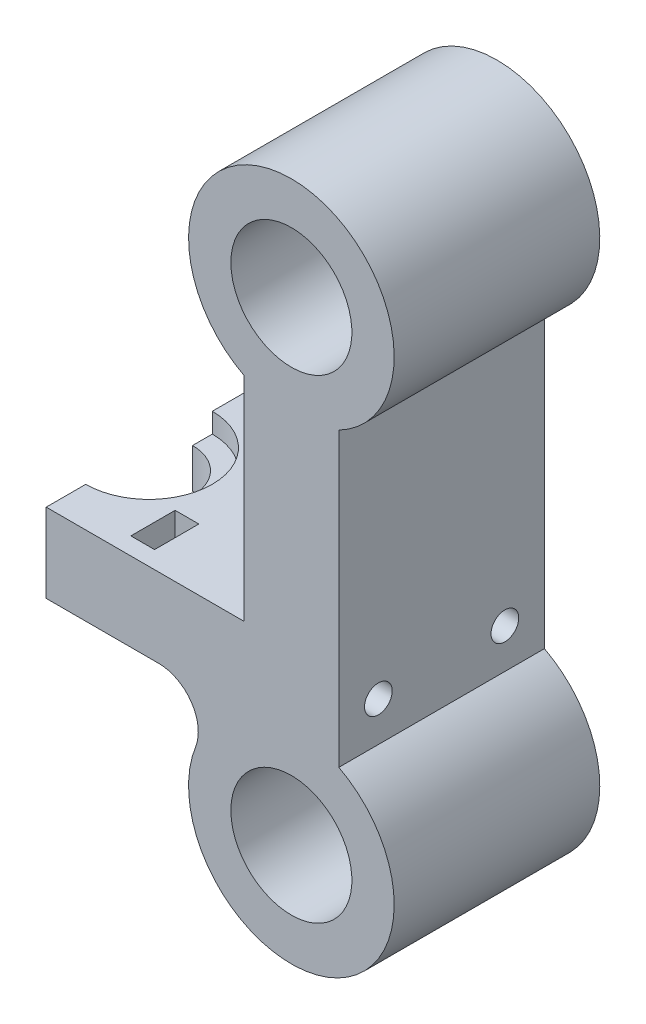
ISO-10303-21;
HEADER;
FILE_DESCRIPTION(('STEP AP214'),'2;1');
FILE_NAME('part.step','',(''),(''),'','','');
FILE_SCHEMA(('AUTOMOTIVE_DESIGN { 1 0 10303 214 1 1 1 1 }'));
ENDSEC;
DATA;
#1=APPLICATION_CONTEXT('core data for automotive mechanical design processes');
#2=APPLICATION_PROTOCOL_DEFINITION('international standard','automotive_design',2000,#1);
#3=PRODUCT_CONTEXT('',#1,'mechanical');
#4=PRODUCT('Part','Part','',(#3));
#5=PRODUCT_RELATED_PRODUCT_CATEGORY('part','',(#4));
#6=PRODUCT_DEFINITION_FORMATION('','',#4);
#7=PRODUCT_DEFINITION_CONTEXT('part definition',#1,'design');
#8=PRODUCT_DEFINITION('design','',#6,#7);
#9=PRODUCT_DEFINITION_SHAPE('','',#8);
#10=(LENGTH_UNIT() NAMED_UNIT(*) SI_UNIT(.MILLI.,.METRE.));
#11=(NAMED_UNIT(*) PLANE_ANGLE_UNIT() SI_UNIT($,.RADIAN.));
#12=(NAMED_UNIT(*) SI_UNIT($,.STERADIAN.) SOLID_ANGLE_UNIT());
#13=UNCERTAINTY_MEASURE_WITH_UNIT(LENGTH_MEASURE(1.E-05),#10,'distance_accuracy_value','');
#14=(GEOMETRIC_REPRESENTATION_CONTEXT(3) GLOBAL_UNCERTAINTY_ASSIGNED_CONTEXT((#13)) GLOBAL_UNIT_ASSIGNED_CONTEXT((#10,
#11,#12)) REPRESENTATION_CONTEXT('',''));
#15=CARTESIAN_POINT('',(0.,0.,0.));
#16=DIRECTION('',(0.,0.,1.));
#17=DIRECTION('',(1.,0.,0.));
#18=AXIS2_PLACEMENT_3D('',#15,#16,#17);
#19=CARTESIAN_POINT('',(13.,-13.4674374053292,21.));
#20=DIRECTION('',(-1.,0.,0.));
#21=DIRECTION('',(0.,0.,1.));
#22=AXIS2_PLACEMENT_3D('',#19,#20,#21);
#23=CYLINDRICAL_SURFACE('',#22,1.75);
#24=CARTESIAN_POINT('',(-22.5,-13.4674374053292,21.));
#25=DIRECTION('',(-1.,0.,0.));
#26=DIRECTION('',(0.,-1.,0.));
#27=AXIS2_PLACEMENT_3D('',#24,#25,#26);
#28=CIRCLE('',#27,1.75);
#29=CARTESIAN_POINT('',(-22.5,-15.2174374053292,21.));
#30=VERTEX_POINT('',#29);
#31=EDGE_CURVE('E212',#30,#30,#28,.F.);
#32=ORIENTED_EDGE('',*,*,#31,.T.);
#33=EDGE_LOOP('',(#32));
#34=FACE_BOUND('',#33,.T.);
#35=CARTESIAN_POINT('',(-31.,-13.4674374053292,21.));
#36=DIRECTION('',(-1.,0.,0.));
#37=DIRECTION('',(0.,0.,-1.));
#38=AXIS2_PLACEMENT_3D('',#35,#36,#37);
#39=CIRCLE('',#38,1.75);
#40=CARTESIAN_POINT('',(-31.,-13.4674374053292,19.25));
#41=VERTEX_POINT('',#40);
#42=EDGE_CURVE('E244',#41,#41,#39,.T.);
#43=ORIENTED_EDGE('',*,*,#42,.T.);
#44=EDGE_LOOP('',(#43));
#45=FACE_BOUND('',#44,.T.);
#46=ADVANCED_FACE('F33',(#34,#45),#23,.F.);
#47=CARTESIAN_POINT('',(13.,-13.4674374053292,5.));
#48=DIRECTION('',(-1.,0.,0.));
#49=DIRECTION('',(0.,0.,1.));
#50=AXIS2_PLACEMENT_3D('',#47,#48,#49);
#51=CYLINDRICAL_SURFACE('',#50,1.75);
#52=CARTESIAN_POINT('',(-19.5,-13.4674374053292,5.));
#53=DIRECTION('',(1.,0.,0.));
#54=DIRECTION('',(0.,1.,0.));
#55=AXIS2_PLACEMENT_3D('',#52,#53,#54);
#56=CIRCLE('',#55,1.75);
#57=CARTESIAN_POINT('',(-19.5,-11.7174374053292,5.));
#58=VERTEX_POINT('',#57);
#59=EDGE_CURVE('E240',#58,#58,#56,.F.);
#60=ORIENTED_EDGE('',*,*,#59,.T.);
#61=EDGE_LOOP('',(#60));
#62=FACE_BOUND('',#61,.T.);
#63=CARTESIAN_POINT('',(6.00000000000001,-13.4674374053292,5.));
#64=DIRECTION('',(-1.,0.,0.));
#65=DIRECTION('',(0.,-1.,0.));
#66=AXIS2_PLACEMENT_3D('',#63,#64,#65);
#67=CIRCLE('',#66,1.75);
#68=CARTESIAN_POINT('',(6.00000000000001,-15.2174374053292,5.));
#69=VERTEX_POINT('',#68);
#70=EDGE_CURVE('E251',#69,#69,#67,.T.);
#71=ORIENTED_EDGE('',*,*,#70,.F.);
#72=EDGE_LOOP('',(#71));
#73=FACE_BOUND('',#72,.T.);
#74=ADVANCED_FACE('F398',(#62,#73),#51,.F.);
#75=CARTESIAN_POINT('',(-31.,-18.4674374053292,26.));
#76=DIRECTION('',(1.,0.,0.));
#77=DIRECTION('',(0.,0.,-1.));
#78=AXIS2_PLACEMENT_3D('',#75,#76,#77);
#79=PLANE('',#78);
#80=CARTESIAN_POINT('',(-31.,-13.4674374053292,5.));
#81=DIRECTION('',(-1.,0.,0.));
#82=DIRECTION('',(0.,0.,1.));
#83=AXIS2_PLACEMENT_3D('',#80,#81,#82);
#84=CIRCLE('',#83,1.75);
#85=CARTESIAN_POINT('',(-31.,-13.4674374053292,6.75));
#86=VERTEX_POINT('',#85);
#87=EDGE_CURVE('E248',#86,#86,#84,.T.);
#88=ORIENTED_EDGE('',*,*,#87,.F.);
#89=EDGE_LOOP('',(#88));
#90=FACE_BOUND('',#89,.T.);
#91=DIRECTION('',(0.,1.,0.));
#92=VECTOR('',#91,1.);
#93=CARTESIAN_POINT('',(-31.,-8.4674374053292,5.));
#94=LINE('',#93,#92);
#95=CARTESIAN_POINT('',(-31.,-8.4674374053292,5.));
#96=VERTEX_POINT('',#95);
#97=CARTESIAN_POINT('',(-31.,-10.9674374053292,5.));
#98=VERTEX_POINT('',#97);
#99=EDGE_CURVE('E359',#96,#98,#94,.F.);
#100=ORIENTED_EDGE('',*,*,#99,.F.);
#101=DIRECTION('',(0.,0.,-1.));
#102=VECTOR('',#101,1.);
#103=CARTESIAN_POINT('',(-31.,-8.46743740532921,26.));
#104=LINE('',#103,#102);
#105=CARTESIAN_POINT('',(-31.,-8.46743740532921,0.));
#106=VERTEX_POINT('',#105);
#107=EDGE_CURVE('E337',#96,#106,#104,.T.);
#108=ORIENTED_EDGE('',*,*,#107,.T.);
#109=DIRECTION('',(0.,-1.,0.));
#110=VECTOR('',#109,1.);
#111=CARTESIAN_POINT('',(-31.,-18.4674374053292,0.));
#112=LINE('',#111,#110);
#113=CARTESIAN_POINT('',(-31.,-18.4674374053292,0.));
#114=VERTEX_POINT('',#113);
#115=EDGE_CURVE('E312',#106,#114,#112,.T.);
#116=ORIENTED_EDGE('',*,*,#115,.T.);
#117=DIRECTION('',(0.,0.,-1.));
#118=VECTOR('',#117,1.);
#119=CARTESIAN_POINT('',(-31.,-18.4674374053292,26.));
#120=LINE('',#119,#118);
#121=CARTESIAN_POINT('',(-31.,-18.4674374053292,5.));
#122=VERTEX_POINT('',#121);
#123=EDGE_CURVE('E333',#122,#114,#120,.T.);
#124=ORIENTED_EDGE('',*,*,#123,.F.);
#125=DIRECTION('',(0.,1.,0.));
#126=VECTOR('',#125,1.);
#127=CARTESIAN_POINT('',(-31.,-8.4674374053292,5.));
#128=LINE('',#127,#126);
#129=CARTESIAN_POINT('',(-31.,-15.9674374053292,5.));
#130=VERTEX_POINT('',#129);
#131=EDGE_CURVE('E271',#130,#122,#128,.F.);
#132=ORIENTED_EDGE('',*,*,#131,.F.);
#133=DIRECTION('',(0.,0.,-1.));
#134=VECTOR('',#133,1.);
#135=CARTESIAN_POINT('',(-31.,-15.9674374053292,26.));
#136=LINE('',#135,#134);
#137=CARTESIAN_POINT('',(-31.,-15.9674374053292,7.5));
#138=VERTEX_POINT('',#137);
#139=EDGE_CURVE('E350',#138,#130,#136,.T.);
#140=ORIENTED_EDGE('',*,*,#139,.F.);
#141=DIRECTION('',(0.,1.,0.));
#142=VECTOR('',#141,1.);
#143=CARTESIAN_POINT('',(-31.,-8.4674374053292,7.5));
#144=LINE('',#143,#142);
#145=CARTESIAN_POINT('',(-31.,-10.9674374053292,7.5));
#146=VERTEX_POINT('',#145);
#147=EDGE_CURVE('E357',#146,#138,#144,.F.);
#148=ORIENTED_EDGE('',*,*,#147,.F.);
#149=DIRECTION('',(0.,0.,1.));
#150=VECTOR('',#149,1.);
#151=CARTESIAN_POINT('',(-31.,-10.9674374053292,26.));
#152=LINE('',#151,#150);
#153=EDGE_CURVE('E355',#98,#146,#152,.T.);
#154=ORIENTED_EDGE('',*,*,#153,.F.);
#155=EDGE_LOOP('',(#100,#108,#116,#124,#132,#140,#148,#154));
#156=FACE_BOUND('',#155,.T.);
#157=ADVANCED_FACE('F405',(#90,#156),#79,.F.);
#158=ORIENTED_EDGE('',*,*,#42,.F.);
#159=EDGE_LOOP('',(#158));
#160=FACE_BOUND('',#159,.T.);
#161=DIRECTION('',(0.,1.,0.));
#162=VECTOR('',#161,1.);
#163=CARTESIAN_POINT('',(-31.,-8.46743740532919,21.));
#164=LINE('',#163,#162);
#165=CARTESIAN_POINT('',(-31.,-10.9674374053292,21.));
#166=VERTEX_POINT('',#165);
#167=CARTESIAN_POINT('',(-31.,-8.4674374053292,21.));
#168=VERTEX_POINT('',#167);
#169=EDGE_CURVE('E354',#166,#168,#164,.T.);
#170=ORIENTED_EDGE('',*,*,#169,.F.);
#171=CARTESIAN_POINT('',(-31.,-10.9674374053292,18.5));
#172=VERTEX_POINT('',#171);
#173=EDGE_CURVE('E352',#172,#166,#152,.T.);
#174=ORIENTED_EDGE('',*,*,#173,.F.);
#175=DIRECTION('',(0.,1.,0.));
#176=VECTOR('',#175,1.);
#177=CARTESIAN_POINT('',(-31.,-8.4674374053292,18.5));
#178=LINE('',#177,#176);
#179=CARTESIAN_POINT('',(-31.,-15.9674374053292,18.5));
#180=VERTEX_POINT('',#179);
#181=EDGE_CURVE('E349',#180,#172,#178,.T.);
#182=ORIENTED_EDGE('',*,*,#181,.F.);
#183=CARTESIAN_POINT('',(-31.,-15.9674374053292,21.));
#184=VERTEX_POINT('',#183);
#185=EDGE_CURVE('E347',#184,#180,#136,.T.);
#186=ORIENTED_EDGE('',*,*,#185,.F.);
#187=DIRECTION('',(0.,1.,0.));
#188=VECTOR('',#187,1.);
#189=CARTESIAN_POINT('',(-31.,-8.46743740532919,21.));
#190=LINE('',#189,#188);
#191=CARTESIAN_POINT('',(-31.,-18.4674374053292,21.));
#192=VERTEX_POINT('',#191);
#193=EDGE_CURVE('E269',#192,#184,#190,.T.);
#194=ORIENTED_EDGE('',*,*,#193,.F.);
#195=CARTESIAN_POINT('',(-31.,-18.4674374053292,26.));
#196=VERTEX_POINT('',#195);
#197=EDGE_CURVE('E334',#196,#192,#120,.T.);
#198=ORIENTED_EDGE('',*,*,#197,.F.);
#199=DIRECTION('',(0.,-1.,0.));
#200=VECTOR('',#199,1.);
#201=CARTESIAN_POINT('',(-31.,-18.4674374053292,26.));
#202=LINE('',#201,#200);
#203=CARTESIAN_POINT('',(-31.,-8.46743740532921,26.));
#204=VERTEX_POINT('',#203);
#205=EDGE_CURVE('E294',#204,#196,#202,.T.);
#206=ORIENTED_EDGE('',*,*,#205,.F.);
#207=EDGE_CURVE('E338',#204,#168,#104,.T.);
#208=ORIENTED_EDGE('',*,*,#207,.T.);
#209=EDGE_LOOP('',(#170,#174,#182,#186,#194,#198,#206,#208));
#210=FACE_BOUND('',#209,.T.);
#211=ADVANCED_FACE('F481',(#160,#210),#79,.F.);
#212=CARTESIAN_POINT('',(0.,30.,26.));
#213=DIRECTION('',(0.,0.,1.));
#214=DIRECTION('',(1.,0.,0.));
#215=AXIS2_PLACEMENT_3D('',#212,#213,#214);
#216=PLANE('',#215);
#217=CARTESIAN_POINT('',(0.,30.,26.));
#218=DIRECTION('',(0.,0.,1.));
#219=DIRECTION('',(1.,0.,0.));
#220=AXIS2_PLACEMENT_3D('',#217,#218,#219);
#221=CIRCLE('',#220,7.65);
#222=CARTESIAN_POINT('',(-7.65000000000001,30.,26.));
#223=VERTEX_POINT('',#222);
#224=EDGE_CURVE('E280',#223,#223,#221,.T.);
#225=ORIENTED_EDGE('',*,*,#224,.F.);
#226=EDGE_LOOP('',(#225));
#227=FACE_BOUND('',#226,.T.);
#228=CARTESIAN_POINT('',(0.,30.,26.));
#229=DIRECTION('',(0.,0.,1.));
#230=DIRECTION('',(1.,0.,0.));
#231=AXIS2_PLACEMENT_3D('',#228,#229,#230);
#232=CIRCLE('',#231,13.);
#233=CARTESIAN_POINT('',(6.,18.4674374053292,26.));
#234=VERTEX_POINT('',#233);
#235=CARTESIAN_POINT('',(-6.,18.4674374053292,26.));
#236=VERTEX_POINT('',#235);
#237=EDGE_CURVE('E286',#234,#236,#232,.T.);
#238=ORIENTED_EDGE('',*,*,#237,.T.);
#239=DIRECTION('',(0.,-1.,0.));
#240=VECTOR('',#239,1.);
#241=CARTESIAN_POINT('',(-6.,18.4674374053292,26.));
#242=LINE('',#241,#240);
#243=CARTESIAN_POINT('',(-5.99999999999999,-8.46743740532921,26.));
#244=VERTEX_POINT('',#243);
#245=EDGE_CURVE('E289',#236,#244,#242,.T.);
#246=ORIENTED_EDGE('',*,*,#245,.T.);
#247=DIRECTION('',(-1.,0.,0.));
#248=VECTOR('',#247,1.);
#249=CARTESIAN_POINT('',(-31.,-8.46743740532921,26.));
#250=LINE('',#249,#248);
#251=EDGE_CURVE('E292',#244,#204,#250,.T.);
#252=ORIENTED_EDGE('',*,*,#251,.T.);
#253=ORIENTED_EDGE('',*,*,#205,.T.);
#254=DIRECTION('',(1.,0.,0.));
#255=VECTOR('',#254,1.);
#256=CARTESIAN_POINT('',(-16.7727644098016,-18.4674374053292,26.));
#257=LINE('',#256,#255);
#258=CARTESIAN_POINT('',(-16.7727644098016,-18.4674374053292,26.));
#259=VERTEX_POINT('',#258);
#260=EDGE_CURVE('E296',#196,#259,#257,.T.);
#261=ORIENTED_EDGE('',*,*,#260,.T.);
#262=CARTESIAN_POINT('',(-16.7727644098016,-23.4674374053292,26.));
#263=DIRECTION('',(0.,0.,-1.));
#264=DIRECTION('',(-1.,0.,0.));
#265=AXIS2_PLACEMENT_3D('',#262,#263,#264);
#266=CIRCLE('',#265,5.);
#267=CARTESIAN_POINT('',(-12.1136631848567,-25.2820381260711,26.));
#268=VERTEX_POINT('',#267);
#269=EDGE_CURVE('E298',#259,#268,#266,.T.);
#270=ORIENTED_EDGE('',*,*,#269,.T.);
#271=CARTESIAN_POINT('',(0.,-30.,26.));
#272=DIRECTION('',(0.,0.,1.));
#273=DIRECTION('',(1.,0.,0.));
#274=AXIS2_PLACEMENT_3D('',#271,#272,#273);
#275=CIRCLE('',#274,13.);
#276=CARTESIAN_POINT('',(6.00000000000001,-18.4674374053292,26.));
#277=VERTEX_POINT('',#276);
#278=EDGE_CURVE('E300',#268,#277,#275,.T.);
#279=ORIENTED_EDGE('',*,*,#278,.T.);
#280=DIRECTION('',(0.,1.,0.));
#281=VECTOR('',#280,1.);
#282=CARTESIAN_POINT('',(6.,18.4674374053292,26.));
#283=LINE('',#282,#281);
#284=EDGE_CURVE('E302',#277,#234,#283,.T.);
#285=ORIENTED_EDGE('',*,*,#284,.T.);
#286=EDGE_LOOP('',(#238,#246,#252,#253,#261,#270,#279,#285));
#287=FACE_BOUND('',#286,.T.);
#288=CARTESIAN_POINT('',(0.,-30.,26.));
#289=DIRECTION('',(0.,0.,1.));
#290=DIRECTION('',(1.,0.,0.));
#291=AXIS2_PLACEMENT_3D('',#288,#289,#290);
#292=CIRCLE('',#291,7.65);
#293=CARTESIAN_POINT('',(-7.64999999999999,-30.,26.));
#294=VERTEX_POINT('',#293);
#295=EDGE_CURVE('E274',#294,#294,#292,.T.);
#296=ORIENTED_EDGE('',*,*,#295,.F.);
#297=EDGE_LOOP('',(#296));
#298=FACE_BOUND('',#297,.T.);
#299=ADVANCED_FACE('F454',(#227,#287,#298),#216,.T.);
#300=CARTESIAN_POINT('',(0.,30.,0.));
#301=DIRECTION('',(0.,0.,1.));
#302=DIRECTION('',(1.,0.,0.));
#303=AXIS2_PLACEMENT_3D('',#300,#301,#302);
#304=PLANE('',#303);
#305=CARTESIAN_POINT('',(0.,30.,0.));
#306=DIRECTION('',(0.,0.,1.));
#307=DIRECTION('',(1.,0.,0.));
#308=AXIS2_PLACEMENT_3D('',#305,#306,#307);
#309=CIRCLE('',#308,13.);
#310=CARTESIAN_POINT('',(6.,18.4674374053292,0.));
#311=VERTEX_POINT('',#310);
#312=CARTESIAN_POINT('',(-6.,18.4674374053292,0.));
#313=VERTEX_POINT('',#312);
#314=EDGE_CURVE('E283',#311,#313,#309,.T.);
#315=ORIENTED_EDGE('',*,*,#314,.F.);
#316=DIRECTION('',(0.,1.,0.));
#317=VECTOR('',#316,1.);
#318=CARTESIAN_POINT('',(6.,18.4674374053292,0.));
#319=LINE('',#318,#317);
#320=CARTESIAN_POINT('',(6.00000000000001,-18.4674374053292,0.));
#321=VERTEX_POINT('',#320);
#322=EDGE_CURVE('E290',#321,#311,#319,.T.);
#323=ORIENTED_EDGE('',*,*,#322,.F.);
#324=CARTESIAN_POINT('',(0.,-30.,0.));
#325=DIRECTION('',(0.,0.,1.));
#326=DIRECTION('',(1.,0.,0.));
#327=AXIS2_PLACEMENT_3D('',#324,#325,#326);
#328=CIRCLE('',#327,13.);
#329=CARTESIAN_POINT('',(-12.1136631848567,-25.2820381260711,0.));
#330=VERTEX_POINT('',#329);
#331=EDGE_CURVE('E319',#330,#321,#328,.T.);
#332=ORIENTED_EDGE('',*,*,#331,.F.);
#333=CARTESIAN_POINT('',(-16.7727644098016,-23.4674374053292,0.));
#334=DIRECTION('',(0.,0.,-1.));
#335=DIRECTION('',(-1.,0.,0.));
#336=AXIS2_PLACEMENT_3D('',#333,#334,#335);
#337=CIRCLE('',#336,5.);
#338=CARTESIAN_POINT('',(-16.7727644098016,-18.4674374053292,0.));
#339=VERTEX_POINT('',#338);
#340=EDGE_CURVE('E317',#339,#330,#337,.T.);
#341=ORIENTED_EDGE('',*,*,#340,.F.);
#342=DIRECTION('',(1.,0.,0.));
#343=VECTOR('',#342,1.);
#344=CARTESIAN_POINT('',(-16.7727644098016,-18.4674374053292,0.));
#345=LINE('',#344,#343);
#346=EDGE_CURVE('E315',#114,#339,#345,.T.);
#347=ORIENTED_EDGE('',*,*,#346,.F.);
#348=ORIENTED_EDGE('',*,*,#115,.F.);
#349=DIRECTION('',(-1.,0.,0.));
#350=VECTOR('',#349,1.);
#351=CARTESIAN_POINT('',(-31.,-8.46743740532921,0.));
#352=LINE('',#351,#350);
#353=CARTESIAN_POINT('',(-5.99999999999999,-8.46743740532921,0.));
#354=VERTEX_POINT('',#353);
#355=EDGE_CURVE('E309',#354,#106,#352,.T.);
#356=ORIENTED_EDGE('',*,*,#355,.F.);
#357=DIRECTION('',(0.,-1.,0.));
#358=VECTOR('',#357,1.);
#359=CARTESIAN_POINT('',(-6.,18.4674374053292,0.));
#360=LINE('',#359,#358);
#361=EDGE_CURVE('E307',#313,#354,#360,.T.);
#362=ORIENTED_EDGE('',*,*,#361,.F.);
#363=EDGE_LOOP('',(#315,#323,#332,#341,#347,#348,#356,#362));
#364=FACE_BOUND('',#363,.T.);
#365=CARTESIAN_POINT('',(0.,30.,0.));
#366=DIRECTION('',(0.,0.,1.));
#367=DIRECTION('',(1.,0.,0.));
#368=AXIS2_PLACEMENT_3D('',#365,#366,#367);
#369=CIRCLE('',#368,7.65);
#370=CARTESIAN_POINT('',(-7.65000000000001,30.,0.));
#371=VERTEX_POINT('',#370);
#372=EDGE_CURVE('E277',#371,#371,#369,.T.);
#373=ORIENTED_EDGE('',*,*,#372,.T.);
#374=EDGE_LOOP('',(#373));
#375=FACE_BOUND('',#374,.T.);
#376=CARTESIAN_POINT('',(0.,-30.,0.));
#377=DIRECTION('',(0.,0.,1.));
#378=DIRECTION('',(1.,0.,0.));
#379=AXIS2_PLACEMENT_3D('',#376,#377,#378);
#380=CIRCLE('',#379,7.65);
#381=CARTESIAN_POINT('',(-7.64999999999999,-30.,0.));
#382=VERTEX_POINT('',#381);
#383=EDGE_CURVE('E273',#382,#382,#380,.T.);
#384=ORIENTED_EDGE('',*,*,#383,.T.);
#385=EDGE_LOOP('',(#384));
#386=FACE_BOUND('',#385,.T.);
#387=ADVANCED_FACE('F445',(#364,#375,#386),#304,.F.);
#388=CARTESIAN_POINT('',(0.,30.,26.));
#389=DIRECTION('',(0.,0.,-1.));
#390=DIRECTION('',(-1.,0.,0.));
#391=AXIS2_PLACEMENT_3D('',#388,#389,#390);
#392=CYLINDRICAL_SURFACE('',#391,13.);
#393=ORIENTED_EDGE('',*,*,#314,.T.);
#394=DIRECTION('',(0.,0.,-1.));
#395=VECTOR('',#394,1.);
#396=CARTESIAN_POINT('',(-6.,18.4674374053292,26.));
#397=LINE('',#396,#395);
#398=EDGE_CURVE('E344',#236,#313,#397,.T.);
#399=ORIENTED_EDGE('',*,*,#398,.F.);
#400=ORIENTED_EDGE('',*,*,#237,.F.);
#401=DIRECTION('',(0.,0.,-1.));
#402=VECTOR('',#401,1.);
#403=CARTESIAN_POINT('',(6.,18.4674374053292,26.));
#404=LINE('',#403,#402);
#405=EDGE_CURVE('E304',#234,#311,#404,.T.);
#406=ORIENTED_EDGE('',*,*,#405,.T.);
#407=EDGE_LOOP('',(#393,#399,#400,#406));
#408=FACE_BOUND('',#407,.T.);
#409=ADVANCED_FACE('F35',(#408),#392,.T.);
#410=CARTESIAN_POINT('',(-6.,18.4674374053292,26.));
#411=DIRECTION('',(1.,0.,0.));
#412=DIRECTION('',(0.,1.,0.));
#413=AXIS2_PLACEMENT_3D('',#410,#411,#412);
#414=PLANE('',#413);
#415=ORIENTED_EDGE('',*,*,#361,.T.);
#416=DIRECTION('',(0.,0.,-1.));
#417=VECTOR('',#416,1.);
#418=CARTESIAN_POINT('',(-5.99999999999999,-8.46743740532921,26.));
#419=LINE('',#418,#417);
#420=EDGE_CURVE('E341',#244,#354,#419,.T.);
#421=ORIENTED_EDGE('',*,*,#420,.F.);
#422=ORIENTED_EDGE('',*,*,#245,.F.);
#423=ORIENTED_EDGE('',*,*,#398,.T.);
#424=EDGE_LOOP('',(#415,#421,#422,#423));
#425=FACE_BOUND('',#424,.T.);
#426=ADVANCED_FACE('F451',(#425),#414,.F.);
#427=CARTESIAN_POINT('',(-31.,-8.46743740532921,26.));
#428=DIRECTION('',(0.,-1.,0.));
#429=DIRECTION('',(1.,0.,0.));
#430=AXIS2_PLACEMENT_3D('',#427,#428,#429);
#431=PLANE('',#430);
#432=DIRECTION('',(1.,0.,0.));
#433=VECTOR('',#432,1.);
#434=CARTESIAN_POINT('',(-22.5,-8.46743740532921,23.8));
#435=LINE('',#434,#433);
#436=CARTESIAN_POINT('',(-22.5,-8.46743740532921,23.8));
#437=VERTEX_POINT('',#436);
#438=CARTESIAN_POINT('',(-19.5,-8.46743740532921,23.8));
#439=VERTEX_POINT('',#438);
#440=EDGE_CURVE('E194',#437,#439,#435,.T.);
#441=ORIENTED_EDGE('',*,*,#440,.F.);
#442=DIRECTION('',(0.,0.,1.));
#443=VECTOR('',#442,1.);
#444=CARTESIAN_POINT('',(-22.5,-8.46743740532921,23.8));
#445=LINE('',#444,#443);
#446=CARTESIAN_POINT('',(-22.5,-8.46743740532921,18.2));
#447=VERTEX_POINT('',#446);
#448=EDGE_CURVE('E48',#447,#437,#445,.T.);
#449=ORIENTED_EDGE('',*,*,#448,.F.);
#450=DIRECTION('',(-1.,0.,0.));
#451=VECTOR('',#450,1.);
#452=CARTESIAN_POINT('',(-22.5,-8.46743740532921,18.2));
#453=LINE('',#452,#451);
#454=CARTESIAN_POINT('',(-19.5,-8.46743740532921,18.2));
#455=VERTEX_POINT('',#454);
#456=EDGE_CURVE('E201',#455,#447,#453,.T.);
#457=ORIENTED_EDGE('',*,*,#456,.F.);
#458=DIRECTION('',(0.,0.,-1.));
#459=VECTOR('',#458,1.);
#460=CARTESIAN_POINT('',(-19.5,-8.46743740532921,23.8));
#461=LINE('',#460,#459);
#462=EDGE_CURVE('E185',#439,#455,#461,.T.);
#463=ORIENTED_EDGE('',*,*,#462,.F.);
#464=EDGE_LOOP('',(#441,#449,#457,#463));
#465=FACE_BOUND('',#464,.T.);
#466=DIRECTION('',(-1.,0.,0.));
#467=VECTOR('',#466,1.);
#468=CARTESIAN_POINT('',(-22.5,-8.46743740532921,2.2));
#469=LINE('',#468,#467);
#470=CARTESIAN_POINT('',(-19.5,-8.46743740532921,2.2));
#471=VERTEX_POINT('',#470);
#472=CARTESIAN_POINT('',(-22.5,-8.46743740532921,2.2));
#473=VERTEX_POINT('',#472);
#474=EDGE_CURVE('E218',#471,#473,#469,.T.);
#475=ORIENTED_EDGE('',*,*,#474,.F.);
#476=DIRECTION('',(0.,0.,-1.));
#477=VECTOR('',#476,1.);
#478=CARTESIAN_POINT('',(-19.5,-8.46743740532921,2.2));
#479=LINE('',#478,#477);
#480=CARTESIAN_POINT('',(-19.5,-8.46743740532921,7.8));
#481=VERTEX_POINT('',#480);
#482=EDGE_CURVE('E216',#481,#471,#479,.T.);
#483=ORIENTED_EDGE('',*,*,#482,.F.);
#484=DIRECTION('',(1.,0.,0.));
#485=VECTOR('',#484,1.);
#486=CARTESIAN_POINT('',(-22.5,-8.46743740532921,7.8));
#487=LINE('',#486,#485);
#488=CARTESIAN_POINT('',(-22.5,-8.46743740532921,7.8));
#489=VERTEX_POINT('',#488);
#490=EDGE_CURVE('E224',#489,#481,#487,.T.);
#491=ORIENTED_EDGE('',*,*,#490,.F.);
#492=DIRECTION('',(0.,0.,1.));
#493=VECTOR('',#492,1.);
#494=CARTESIAN_POINT('',(-22.5,-8.46743740532921,2.2));
#495=LINE('',#494,#493);
#496=EDGE_CURVE('E221',#473,#489,#495,.T.);
#497=ORIENTED_EDGE('',*,*,#496,.F.);
#498=EDGE_LOOP('',(#475,#483,#491,#497));
#499=FACE_BOUND('',#498,.T.);
#500=CARTESIAN_POINT('',(-31.,-8.4674374053292,13.));
#501=DIRECTION('',(0.,1.,0.));
#502=DIRECTION('',(0.,0.,1.));
#503=AXIS2_PLACEMENT_3D('',#500,#501,#502);
#504=CIRCLE('',#503,8.);
#505=EDGE_CURVE('E267',#168,#96,#504,.T.);
#506=ORIENTED_EDGE('',*,*,#505,.F.);
#507=ORIENTED_EDGE('',*,*,#207,.F.);
#508=ORIENTED_EDGE('',*,*,#251,.F.);
#509=ORIENTED_EDGE('',*,*,#420,.T.);
#510=ORIENTED_EDGE('',*,*,#355,.T.);
#511=ORIENTED_EDGE('',*,*,#107,.F.);
#512=EDGE_LOOP('',(#506,#507,#508,#509,#510,#511));
#513=FACE_BOUND('',#512,.T.);
#514=ADVANCED_FACE('F198',(#465,#499,#513),#431,.F.);
#515=CARTESIAN_POINT('',(-16.7727644098016,-18.4674374053292,26.));
#516=DIRECTION('',(0.,1.,0.));
#517=DIRECTION('',(-1.,0.,0.));
#518=AXIS2_PLACEMENT_3D('',#515,#516,#517);
#519=PLANE('',#518);
#520=DIRECTION('',(-1.,0.,0.));
#521=VECTOR('',#520,1.);
#522=CARTESIAN_POINT('',(-16.7727644098016,-18.4674374053292,18.2));
#523=LINE('',#522,#521);
#524=CARTESIAN_POINT('',(-19.5,-18.4674374053292,18.2));
#525=VERTEX_POINT('',#524);
#526=CARTESIAN_POINT('',(-22.5,-18.4674374053292,18.2));
#527=VERTEX_POINT('',#526);
#528=EDGE_CURVE('E11',#525,#527,#523,.T.);
#529=ORIENTED_EDGE('',*,*,#528,.T.);
#530=DIRECTION('',(0.,0.,1.));
#531=VECTOR('',#530,1.);
#532=CARTESIAN_POINT('',(-22.5,-18.4674374053292,26.));
#533=LINE('',#532,#531);
#534=CARTESIAN_POINT('',(-22.5,-18.4674374053292,23.8));
#535=VERTEX_POINT('',#534);
#536=EDGE_CURVE('E213',#527,#535,#533,.T.);
#537=ORIENTED_EDGE('',*,*,#536,.T.);
#538=DIRECTION('',(1.,0.,0.));
#539=VECTOR('',#538,1.);
#540=CARTESIAN_POINT('',(-16.7727644098016,-18.4674374053292,23.8));
#541=LINE('',#540,#539);
#542=CARTESIAN_POINT('',(-19.5,-18.4674374053292,23.8));
#543=VERTEX_POINT('',#542);
#544=EDGE_CURVE('E41',#535,#543,#541,.T.);
#545=ORIENTED_EDGE('',*,*,#544,.T.);
#546=DIRECTION('',(0.,0.,-1.));
#547=VECTOR('',#546,1.);
#548=CARTESIAN_POINT('',(-19.5,-18.4674374053292,26.));
#549=LINE('',#548,#547);
#550=EDGE_CURVE('E188',#543,#525,#549,.T.);
#551=ORIENTED_EDGE('',*,*,#550,.T.);
#552=EDGE_LOOP('',(#529,#537,#545,#551));
#553=FACE_BOUND('',#552,.T.);
#554=DIRECTION('',(1.,0.,0.));
#555=VECTOR('',#554,1.);
#556=CARTESIAN_POINT('',(-16.7727644098016,-18.4674374053292,7.8));
#557=LINE('',#556,#555);
#558=CARTESIAN_POINT('',(-22.5,-18.4674374053292,7.8));
#559=VERTEX_POINT('',#558);
#560=CARTESIAN_POINT('',(-19.5,-18.4674374053292,7.8));
#561=VERTEX_POINT('',#560);
#562=EDGE_CURVE('E372',#559,#561,#557,.T.);
#563=ORIENTED_EDGE('',*,*,#562,.T.);
#564=DIRECTION('',(0.,0.,-1.));
#565=VECTOR('',#564,1.);
#566=CARTESIAN_POINT('',(-19.5,-18.4674374053292,26.));
#567=LINE('',#566,#565);
#568=CARTESIAN_POINT('',(-19.5,-18.4674374053292,2.2));
#569=VERTEX_POINT('',#568);
#570=EDGE_CURVE('E241',#561,#569,#567,.T.);
#571=ORIENTED_EDGE('',*,*,#570,.T.);
#572=DIRECTION('',(-1.,0.,0.));
#573=VECTOR('',#572,1.);
#574=CARTESIAN_POINT('',(-16.7727644098016,-18.4674374053292,2.2));
#575=LINE('',#574,#573);
#576=CARTESIAN_POINT('',(-22.5,-18.4674374053292,2.2));
#577=VERTEX_POINT('',#576);
#578=EDGE_CURVE('E361',#569,#577,#575,.T.);
#579=ORIENTED_EDGE('',*,*,#578,.T.);
#580=DIRECTION('',(0.,0.,1.));
#581=VECTOR('',#580,1.);
#582=CARTESIAN_POINT('',(-22.5,-18.4674374053292,26.));
#583=LINE('',#582,#581);
#584=EDGE_CURVE('E237',#577,#559,#583,.T.);
#585=ORIENTED_EDGE('',*,*,#584,.T.);
#586=EDGE_LOOP('',(#563,#571,#579,#585));
#587=FACE_BOUND('',#586,.T.);
#588=CARTESIAN_POINT('',(-31.,-18.4674374053292,13.));
#589=DIRECTION('',(0.,1.,0.));
#590=DIRECTION('',(0.,0.,1.));
#591=AXIS2_PLACEMENT_3D('',#588,#589,#590);
#592=CIRCLE('',#591,8.);
#593=EDGE_CURVE('E252',#192,#122,#592,.T.);
#594=ORIENTED_EDGE('',*,*,#593,.T.);
#595=ORIENTED_EDGE('',*,*,#123,.T.);
#596=ORIENTED_EDGE('',*,*,#346,.T.);
#597=DIRECTION('',(0.,0.,-1.));
#598=VECTOR('',#597,1.);
#599=CARTESIAN_POINT('',(-16.7727644098016,-18.4674374053292,26.));
#600=LINE('',#599,#598);
#601=EDGE_CURVE('E330',#259,#339,#600,.T.);
#602=ORIENTED_EDGE('',*,*,#601,.F.);
#603=ORIENTED_EDGE('',*,*,#260,.F.);
#604=ORIENTED_EDGE('',*,*,#197,.T.);
#605=EDGE_LOOP('',(#594,#595,#596,#602,#603,#604));
#606=FACE_BOUND('',#605,.T.);
#607=ADVANCED_FACE('F379',(#553,#587,#606),#519,.F.);
#608=CARTESIAN_POINT('',(-16.7727644098016,-23.4674374053292,26.));
#609=DIRECTION('',(0.,0.,-1.));
#610=DIRECTION('',(-1.,0.,0.));
#611=AXIS2_PLACEMENT_3D('',#608,#609,#610);
#612=CYLINDRICAL_SURFACE('',#611,5.);
#613=ORIENTED_EDGE('',*,*,#340,.T.);
#614=DIRECTION('',(0.,0.,-1.));
#615=VECTOR('',#614,1.);
#616=CARTESIAN_POINT('',(-12.1136631848567,-25.2820381260711,26.));
#617=LINE('',#616,#615);
#618=EDGE_CURVE('E327',#268,#330,#617,.T.);
#619=ORIENTED_EDGE('',*,*,#618,.F.);
#620=ORIENTED_EDGE('',*,*,#269,.F.);
#621=ORIENTED_EDGE('',*,*,#601,.T.);
#622=EDGE_LOOP('',(#613,#619,#620,#621));
#623=FACE_BOUND('',#622,.T.);
#624=ADVANCED_FACE('F463',(#623),#612,.F.);
#625=CARTESIAN_POINT('',(0.,-30.,26.));
#626=DIRECTION('',(0.,0.,-1.));
#627=DIRECTION('',(-1.,0.,0.));
#628=AXIS2_PLACEMENT_3D('',#625,#626,#627);
#629=CYLINDRICAL_SURFACE('',#628,13.);
#630=ORIENTED_EDGE('',*,*,#331,.T.);
#631=DIRECTION('',(0.,0.,-1.));
#632=VECTOR('',#631,1.);
#633=CARTESIAN_POINT('',(6.00000000000001,-18.4674374053292,26.));
#634=LINE('',#633,#632);
#635=EDGE_CURVE('E324',#277,#321,#634,.T.);
#636=ORIENTED_EDGE('',*,*,#635,.F.);
#637=ORIENTED_EDGE('',*,*,#278,.F.);
#638=ORIENTED_EDGE('',*,*,#618,.T.);
#639=EDGE_LOOP('',(#630,#636,#637,#638));
#640=FACE_BOUND('',#639,.T.);
#641=ADVANCED_FACE('F431',(#640),#629,.T.);
#642=CARTESIAN_POINT('',(6.,18.4674374053292,26.));
#643=DIRECTION('',(-1.,0.,0.));
#644=DIRECTION('',(0.,-1.,0.));
#645=AXIS2_PLACEMENT_3D('',#642,#643,#644);
#646=PLANE('',#645);
#647=CARTESIAN_POINT('',(6.00000000000001,-13.4674374053292,21.));
#648=DIRECTION('',(-1.,0.,0.));
#649=DIRECTION('',(0.,-1.,0.));
#650=AXIS2_PLACEMENT_3D('',#647,#648,#649);
#651=CIRCLE('',#650,1.75);
#652=CARTESIAN_POINT('',(6.00000000000001,-15.2174374053292,21.));
#653=VERTEX_POINT('',#652);
#654=EDGE_CURVE('E247',#653,#653,#651,.T.);
#655=ORIENTED_EDGE('',*,*,#654,.T.);
#656=EDGE_LOOP('',(#655));
#657=FACE_BOUND('',#656,.T.);
#658=ORIENTED_EDGE('',*,*,#70,.T.);
#659=EDGE_LOOP('',(#658));
#660=FACE_BOUND('',#659,.T.);
#661=ORIENTED_EDGE('',*,*,#322,.T.);
#662=ORIENTED_EDGE('',*,*,#405,.F.);
#663=ORIENTED_EDGE('',*,*,#284,.F.);
#664=ORIENTED_EDGE('',*,*,#635,.T.);
#665=EDGE_LOOP('',(#661,#662,#663,#664));
#666=FACE_BOUND('',#665,.T.);
#667=ADVANCED_FACE('F427',(#657,#660,#666),#646,.F.);
#668=CARTESIAN_POINT('',(0.,30.,26.));
#669=DIRECTION('',(0.,0.,-1.));
#670=DIRECTION('',(-1.,0.,0.));
#671=AXIS2_PLACEMENT_3D('',#668,#669,#670);
#672=CYLINDRICAL_SURFACE('',#671,7.65);
#673=CARTESIAN_POINT('',(-7.65000000000001,30.,26.));
#674=CARTESIAN_POINT('',(-7.65000000000001,30.,25.7291666666667));
#675=CARTESIAN_POINT('',(-7.65000000000001,30.,25.4583333333333));
#676=CARTESIAN_POINT('',(-7.65000000000001,30.,24.9166666666667));
#677=CARTESIAN_POINT('',(-7.65000000000001,30.,24.6458333333333));
#678=CARTESIAN_POINT('',(-7.65000000000001,30.,24.1041666666667));
#679=CARTESIAN_POINT('',(-7.65000000000001,30.,23.8333333333333));
#680=CARTESIAN_POINT('',(-7.65000000000001,30.,23.2916666666667));
#681=CARTESIAN_POINT('',(-7.65000000000001,30.,23.0208333333333));
#682=CARTESIAN_POINT('',(-7.65000000000001,30.,22.4791666666667));
#683=CARTESIAN_POINT('',(-7.65000000000001,30.,22.2083333333333));
#684=CARTESIAN_POINT('',(-7.65000000000001,30.,21.6666666666667));
#685=CARTESIAN_POINT('',(-7.65000000000001,30.,21.3958333333333));
#686=CARTESIAN_POINT('',(-7.65000000000001,30.,20.8541666666667));
#687=CARTESIAN_POINT('',(-7.65000000000001,30.,20.5833333333333));
#688=CARTESIAN_POINT('',(-7.65000000000001,30.,20.0416666666667));
#689=CARTESIAN_POINT('',(-7.65000000000001,30.,19.7708333333333));
#690=CARTESIAN_POINT('',(-7.65000000000001,30.,19.2291666666667));
#691=CARTESIAN_POINT('',(-7.65000000000001,30.,18.9583333333333));
#692=CARTESIAN_POINT('',(-7.65000000000001,30.,18.4166666666667));
#693=CARTESIAN_POINT('',(-7.65000000000001,30.,18.1458333333333));
#694=CARTESIAN_POINT('',(-7.65000000000001,30.,17.6041666666667));
#695=CARTESIAN_POINT('',(-7.65000000000001,30.,17.3333333333333));
#696=CARTESIAN_POINT('',(-7.65000000000001,30.,16.7916666666667));
#697=CARTESIAN_POINT('',(-7.65000000000001,30.,16.5208333333333));
#698=CARTESIAN_POINT('',(-7.65000000000001,30.,15.9791666666667));
#699=CARTESIAN_POINT('',(-7.65000000000001,30.,15.7083333333333));
#700=CARTESIAN_POINT('',(-7.65000000000001,30.,15.1666666666667));
#701=CARTESIAN_POINT('',(-7.65000000000001,30.,14.8958333333333));
#702=CARTESIAN_POINT('',(-7.65000000000001,30.,14.3541666666667));
#703=CARTESIAN_POINT('',(-7.65000000000001,30.,14.0833333333333));
#704=CARTESIAN_POINT('',(-7.65000000000001,30.,13.5416666666667));
#705=CARTESIAN_POINT('',(-7.65000000000001,30.,13.2708333333333));
#706=CARTESIAN_POINT('',(-7.65000000000001,30.,12.7291666666667));
#707=CARTESIAN_POINT('',(-7.65000000000001,30.,12.4583333333333));
#708=CARTESIAN_POINT('',(-7.65000000000001,30.,11.9166666666667));
#709=CARTESIAN_POINT('',(-7.65000000000001,30.,11.6458333333333));
#710=CARTESIAN_POINT('',(-7.65000000000001,30.,11.1041666666667));
#711=CARTESIAN_POINT('',(-7.65000000000001,30.,10.8333333333333));
#712=CARTESIAN_POINT('',(-7.65000000000001,30.,10.2916666666667));
#713=CARTESIAN_POINT('',(-7.65000000000001,30.,10.0208333333333));
#714=CARTESIAN_POINT('',(-7.65000000000001,30.,9.47916666666667));
#715=CARTESIAN_POINT('',(-7.65000000000001,30.,9.20833333333333));
#716=CARTESIAN_POINT('',(-7.65000000000001,30.,8.66666666666667));
#717=CARTESIAN_POINT('',(-7.65000000000001,30.,8.39583333333333));
#718=CARTESIAN_POINT('',(-7.65000000000001,30.,7.85416666666667));
#719=CARTESIAN_POINT('',(-7.65000000000001,30.,7.58333333333333));
#720=CARTESIAN_POINT('',(-7.65000000000001,30.,7.04166666666667));
#721=CARTESIAN_POINT('',(-7.65000000000001,30.,6.77083333333333));
#722=CARTESIAN_POINT('',(-7.65000000000001,30.,6.22916666666667));
#723=CARTESIAN_POINT('',(-7.65000000000001,30.,5.95833333333333));
#724=CARTESIAN_POINT('',(-7.65000000000001,30.,5.41666666666667));
#725=CARTESIAN_POINT('',(-7.65000000000001,30.,5.14583333333333));
#726=CARTESIAN_POINT('',(-7.65000000000001,30.,4.60416666666667));
#727=CARTESIAN_POINT('',(-7.65000000000001,30.,4.33333333333333));
#728=CARTESIAN_POINT('',(-7.65000000000001,30.,3.79166666666667));
#729=CARTESIAN_POINT('',(-7.65000000000001,30.,3.52083333333333));
#730=CARTESIAN_POINT('',(-7.65000000000001,30.,2.97916666666667));
#731=CARTESIAN_POINT('',(-7.65000000000001,30.,2.70833333333333));
#732=CARTESIAN_POINT('',(-7.65000000000001,30.,2.16666666666667));
#733=CARTESIAN_POINT('',(-7.65000000000001,30.,1.89583333333333));
#734=CARTESIAN_POINT('',(-7.65000000000001,30.,1.35416666666667));
#735=CARTESIAN_POINT('',(-7.65000000000001,30.,1.08333333333333));
#736=CARTESIAN_POINT('',(-7.65000000000001,30.,0.541666666666667));
#737=CARTESIAN_POINT('',(-7.65000000000001,30.,0.270833333333334));
#738=CARTESIAN_POINT('',(-7.65000000000001,30.,0.));
#739=B_SPLINE_CURVE_WITH_KNOTS('',3,(#673,#674,#675,#676,#677,#678,#679,#680,#681,#682,#683,
#684,#685,#686,#687,#688,#689,#690,#691,#692,#693,#694,#695,#696,#697,#698,#699,#700,#701,#702,
#703,#704,#705,#706,#707,#708,#709,#710,#711,#712,#713,#714,#715,#716,#717,#718,#719,#720,#721,
#722,#723,#724,#725,#726,#727,#728,#729,#730,#731,#732,#733,#734,#735,#736,#737,#738),
.UNSPECIFIED.,.F.,.F.,(4,2,2,2,2,2,2,2,2,2,2,2,2,2,2,2,2,2,2,2,2,2,2,2,2,2,2,2,2,2,2,2,4),(0.,
0.812500000000001,1.625,2.4375,3.25,4.0625,4.875,5.6875,6.5,7.3125,8.125,8.9375,9.75,10.5625,
11.375,12.1875,13.,13.8125,14.625,15.4375,16.25,17.0625,17.875,18.6875,19.5,20.3125,21.125,
21.9375,22.75,23.5625,24.375,25.1875,26.),.UNSPECIFIED.);
#740=EDGE_CURVE('BSEAM430',#223,#371,#739,.T.);
#741=ORIENTED_EDGE('',*,*,#224,.T.);
#742=ORIENTED_EDGE('',*,*,#372,.F.);
#743=ORIENTED_EDGE('',*,*,#740,.T.);
#744=ORIENTED_EDGE('',*,*,#740,.F.);
#745=EDGE_LOOP('',(#741,#743,#742,#744));
#746=FACE_BOUND('',#745,.T.);
#747=ADVANCED_FACE('F430',(#746),#672,.F.);
#748=CARTESIAN_POINT('',(0.,-30.,26.));
#749=DIRECTION('',(0.,0.,-1.));
#750=DIRECTION('',(-1.,0.,0.));
#751=AXIS2_PLACEMENT_3D('',#748,#749,#750);
#752=CYLINDRICAL_SURFACE('',#751,7.65);
#753=CARTESIAN_POINT('',(-7.64999999999999,-30.,26.));
#754=CARTESIAN_POINT('',(-7.64999999999999,-30.,25.7291666666667));
#755=CARTESIAN_POINT('',(-7.64999999999999,-30.,25.4583333333333));
#756=CARTESIAN_POINT('',(-7.64999999999999,-30.,24.9166666666667));
#757=CARTESIAN_POINT('',(-7.64999999999999,-30.,24.6458333333333));
#758=CARTESIAN_POINT('',(-7.64999999999999,-30.,24.1041666666667));
#759=CARTESIAN_POINT('',(-7.64999999999999,-30.,23.8333333333333));
#760=CARTESIAN_POINT('',(-7.64999999999999,-30.,23.2916666666667));
#761=CARTESIAN_POINT('',(-7.64999999999999,-30.,23.0208333333333));
#762=CARTESIAN_POINT('',(-7.64999999999999,-30.,22.4791666666667));
#763=CARTESIAN_POINT('',(-7.64999999999999,-30.,22.2083333333333));
#764=CARTESIAN_POINT('',(-7.64999999999999,-30.,21.6666666666667));
#765=CARTESIAN_POINT('',(-7.64999999999999,-30.,21.3958333333333));
#766=CARTESIAN_POINT('',(-7.64999999999999,-30.,20.8541666666667));
#767=CARTESIAN_POINT('',(-7.64999999999999,-30.,20.5833333333333));
#768=CARTESIAN_POINT('',(-7.64999999999999,-30.,20.0416666666667));
#769=CARTESIAN_POINT('',(-7.64999999999999,-30.,19.7708333333333));
#770=CARTESIAN_POINT('',(-7.64999999999999,-30.,19.2291666666667));
#771=CARTESIAN_POINT('',(-7.64999999999999,-30.,18.9583333333333));
#772=CARTESIAN_POINT('',(-7.64999999999999,-30.,18.4166666666667));
#773=CARTESIAN_POINT('',(-7.64999999999999,-30.,18.1458333333333));
#774=CARTESIAN_POINT('',(-7.64999999999999,-30.,17.6041666666667));
#775=CARTESIAN_POINT('',(-7.64999999999999,-30.,17.3333333333333));
#776=CARTESIAN_POINT('',(-7.64999999999999,-30.,16.7916666666667));
#777=CARTESIAN_POINT('',(-7.64999999999999,-30.,16.5208333333333));
#778=CARTESIAN_POINT('',(-7.64999999999999,-30.,15.9791666666667));
#779=CARTESIAN_POINT('',(-7.64999999999999,-30.,15.7083333333333));
#780=CARTESIAN_POINT('',(-7.64999999999999,-30.,15.1666666666667));
#781=CARTESIAN_POINT('',(-7.64999999999999,-30.,14.8958333333333));
#782=CARTESIAN_POINT('',(-7.64999999999999,-30.,14.3541666666667));
#783=CARTESIAN_POINT('',(-7.64999999999999,-30.,14.0833333333333));
#784=CARTESIAN_POINT('',(-7.64999999999999,-30.,13.5416666666667));
#785=CARTESIAN_POINT('',(-7.64999999999999,-30.,13.2708333333333));
#786=CARTESIAN_POINT('',(-7.64999999999999,-30.,12.7291666666667));
#787=CARTESIAN_POINT('',(-7.64999999999999,-30.,12.4583333333333));
#788=CARTESIAN_POINT('',(-7.64999999999999,-30.,11.9166666666667));
#789=CARTESIAN_POINT('',(-7.64999999999999,-30.,11.6458333333333));
#790=CARTESIAN_POINT('',(-7.64999999999999,-30.,11.1041666666667));
#791=CARTESIAN_POINT('',(-7.64999999999999,-30.,10.8333333333333));
#792=CARTESIAN_POINT('',(-7.64999999999999,-30.,10.2916666666667));
#793=CARTESIAN_POINT('',(-7.64999999999999,-30.,10.0208333333333));
#794=CARTESIAN_POINT('',(-7.64999999999999,-30.,9.47916666666667));
#795=CARTESIAN_POINT('',(-7.64999999999999,-30.,9.20833333333333));
#796=CARTESIAN_POINT('',(-7.64999999999999,-30.,8.66666666666667));
#797=CARTESIAN_POINT('',(-7.64999999999999,-30.,8.39583333333333));
#798=CARTESIAN_POINT('',(-7.64999999999999,-30.,7.85416666666667));
#799=CARTESIAN_POINT('',(-7.64999999999999,-30.,7.58333333333333));
#800=CARTESIAN_POINT('',(-7.64999999999999,-30.,7.04166666666667));
#801=CARTESIAN_POINT('',(-7.64999999999999,-30.,6.77083333333333));
#802=CARTESIAN_POINT('',(-7.64999999999999,-30.,6.22916666666667));
#803=CARTESIAN_POINT('',(-7.64999999999999,-30.,5.95833333333333));
#804=CARTESIAN_POINT('',(-7.64999999999999,-30.,5.41666666666667));
#805=CARTESIAN_POINT('',(-7.64999999999999,-30.,5.14583333333333));
#806=CARTESIAN_POINT('',(-7.64999999999999,-30.,4.60416666666667));
#807=CARTESIAN_POINT('',(-7.64999999999999,-30.,4.33333333333333));
#808=CARTESIAN_POINT('',(-7.64999999999999,-30.,3.79166666666667));
#809=CARTESIAN_POINT('',(-7.64999999999999,-30.,3.52083333333333));
#810=CARTESIAN_POINT('',(-7.64999999999999,-30.,2.97916666666667));
#811=CARTESIAN_POINT('',(-7.64999999999999,-30.,2.70833333333333));
#812=CARTESIAN_POINT('',(-7.64999999999999,-30.,2.16666666666667));
#813=CARTESIAN_POINT('',(-7.64999999999999,-30.,1.89583333333333));
#814=CARTESIAN_POINT('',(-7.64999999999999,-30.,1.35416666666667));
#815=CARTESIAN_POINT('',(-7.64999999999999,-30.,1.08333333333333));
#816=CARTESIAN_POINT('',(-7.64999999999999,-30.,0.541666666666667));
#817=CARTESIAN_POINT('',(-7.64999999999999,-30.,0.270833333333334));
#818=CARTESIAN_POINT('',(-7.64999999999999,-30.,0.));
#819=B_SPLINE_CURVE_WITH_KNOTS('',3,(#753,#754,#755,#756,#757,#758,#759,#760,#761,#762,#763,
#764,#765,#766,#767,#768,#769,#770,#771,#772,#773,#774,#775,#776,#777,#778,#779,#780,#781,#782,
#783,#784,#785,#786,#787,#788,#789,#790,#791,#792,#793,#794,#795,#796,#797,#798,#799,#800,#801,
#802,#803,#804,#805,#806,#807,#808,#809,#810,#811,#812,#813,#814,#815,#816,#817,#818),
.UNSPECIFIED.,.F.,.F.,(4,2,2,2,2,2,2,2,2,2,2,2,2,2,2,2,2,2,2,2,2,2,2,2,2,2,2,2,2,2,2,2,4),(0.,
0.812500000000001,1.625,2.4375,3.25,4.0625,4.875,5.6875,6.5,7.3125,8.125,8.9375,9.75,10.5625,
11.375,12.1875,13.,13.8125,14.625,15.4375,16.25,17.0625,17.875,18.6875,19.5,20.3125,21.125,
21.9375,22.75,23.5625,24.375,25.1875,26.),.UNSPECIFIED.);
#820=EDGE_CURVE('BSEAM501',#294,#382,#819,.T.);
#821=ORIENTED_EDGE('',*,*,#295,.T.);
#822=ORIENTED_EDGE('',*,*,#383,.F.);
#823=ORIENTED_EDGE('',*,*,#820,.T.);
#824=ORIENTED_EDGE('',*,*,#820,.F.);
#825=EDGE_LOOP('',(#821,#823,#822,#824));
#826=FACE_BOUND('',#825,.T.);
#827=ADVANCED_FACE('F501',(#826),#752,.F.);
#828=CARTESIAN_POINT('',(-31.,-8.4674374053292,13.));
#829=DIRECTION('',(0.,1.,0.));
#830=DIRECTION('',(0.,0.,1.));
#831=AXIS2_PLACEMENT_3D('',#828,#829,#830);
#832=CYLINDRICAL_SURFACE('',#831,8.);
#833=ORIENTED_EDGE('',*,*,#99,.T.);
#834=CARTESIAN_POINT('',(-31.,-10.9674374053292,13.));
#835=DIRECTION('',(0.,1.,0.));
#836=DIRECTION('',(0.,0.,1.));
#837=AXIS2_PLACEMENT_3D('',#834,#835,#836);
#838=CIRCLE('',#837,8.);
#839=EDGE_CURVE('E264',#166,#98,#838,.T.);
#840=ORIENTED_EDGE('',*,*,#839,.F.);
#841=ORIENTED_EDGE('',*,*,#169,.T.);
#842=ORIENTED_EDGE('',*,*,#505,.T.);
#843=EDGE_LOOP('',(#833,#840,#841,#842));
#844=FACE_BOUND('',#843,.T.);
#845=ADVANCED_FACE('F499',(#844),#832,.F.);
#846=CARTESIAN_POINT('',(-31.,-10.9674374053292,21.));
#847=DIRECTION('',(0.,1.,0.));
#848=DIRECTION('',(0.,0.,1.));
#849=AXIS2_PLACEMENT_3D('',#846,#847,#848);
#850=PLANE('',#849);
#851=ORIENTED_EDGE('',*,*,#153,.T.);
#852=CARTESIAN_POINT('',(-31.,-10.9674374053292,13.));
#853=DIRECTION('',(0.,1.,0.));
#854=DIRECTION('',(0.,0.,1.));
#855=AXIS2_PLACEMENT_3D('',#852,#853,#854);
#856=CIRCLE('',#855,5.5);
#857=EDGE_CURVE('E261',#172,#146,#856,.T.);
#858=ORIENTED_EDGE('',*,*,#857,.F.);
#859=ORIENTED_EDGE('',*,*,#173,.T.);
#860=ORIENTED_EDGE('',*,*,#839,.T.);
#861=EDGE_LOOP('',(#851,#858,#859,#860));
#862=FACE_BOUND('',#861,.T.);
#863=ADVANCED_FACE('F496',(#862),#850,.T.);
#864=CARTESIAN_POINT('',(-31.,-8.4674374053292,13.));
#865=DIRECTION('',(0.,1.,0.));
#866=DIRECTION('',(0.,0.,1.));
#867=AXIS2_PLACEMENT_3D('',#864,#865,#866);
#868=CYLINDRICAL_SURFACE('',#867,5.49999999999999);
#869=ORIENTED_EDGE('',*,*,#147,.T.);
#870=CARTESIAN_POINT('',(-31.,-15.9674374053292,13.));
#871=DIRECTION('',(0.,1.,0.));
#872=DIRECTION('',(0.,0.,1.));
#873=AXIS2_PLACEMENT_3D('',#870,#871,#872);
#874=CIRCLE('',#873,5.49999999999999);
#875=EDGE_CURVE('E258',#180,#138,#874,.T.);
#876=ORIENTED_EDGE('',*,*,#875,.F.);
#877=ORIENTED_EDGE('',*,*,#181,.T.);
#878=ORIENTED_EDGE('',*,*,#857,.T.);
#879=EDGE_LOOP('',(#869,#876,#877,#878));
#880=FACE_BOUND('',#879,.T.);
#881=ADVANCED_FACE('F492',(#880),#868,.F.);
#882=CARTESIAN_POINT('',(-31.,-15.9674374053292,18.5));
#883=DIRECTION('',(0.,-1.,0.));
#884=DIRECTION('',(0.,0.,-1.));
#885=AXIS2_PLACEMENT_3D('',#882,#883,#884);
#886=PLANE('',#885);
#887=ORIENTED_EDGE('',*,*,#185,.T.);
#888=ORIENTED_EDGE('',*,*,#875,.T.);
#889=ORIENTED_EDGE('',*,*,#139,.T.);
#890=CARTESIAN_POINT('',(-31.,-15.9674374053292,13.));
#891=DIRECTION('',(0.,1.,0.));
#892=DIRECTION('',(0.,0.,1.));
#893=AXIS2_PLACEMENT_3D('',#890,#891,#892);
#894=CIRCLE('',#893,8.);
#895=EDGE_CURVE('E255',#184,#130,#894,.T.);
#896=ORIENTED_EDGE('',*,*,#895,.F.);
#897=EDGE_LOOP('',(#887,#888,#889,#896));
#898=FACE_BOUND('',#897,.T.);
#899=ADVANCED_FACE('F487',(#898),#886,.T.);
#900=CARTESIAN_POINT('',(-31.,-8.4674374053292,13.));
#901=DIRECTION('',(0.,1.,0.));
#902=DIRECTION('',(0.,0.,1.));
#903=AXIS2_PLACEMENT_3D('',#900,#901,#902);
#904=CYLINDRICAL_SURFACE('',#903,8.);
#905=ORIENTED_EDGE('',*,*,#131,.T.);
#906=ORIENTED_EDGE('',*,*,#593,.F.);
#907=ORIENTED_EDGE('',*,*,#193,.T.);
#908=ORIENTED_EDGE('',*,*,#895,.T.);
#909=EDGE_LOOP('',(#905,#906,#907,#908));
#910=FACE_BOUND('',#909,.T.);
#911=ADVANCED_FACE('F421',(#910),#904,.F.);
#912=CARTESIAN_POINT('',(-22.5,-13.4674374053292,5.));
#913=DIRECTION('',(-1.,0.,0.));
#914=DIRECTION('',(0.,-1.,0.));
#915=AXIS2_PLACEMENT_3D('',#912,#913,#914);
#916=CIRCLE('',#915,1.75);
#917=CARTESIAN_POINT('',(-22.5,-15.2174374053292,5.));
#918=VERTEX_POINT('',#917);
#919=EDGE_CURVE('E230',#918,#918,#916,.F.);
#920=ORIENTED_EDGE('',*,*,#919,.T.);
#921=EDGE_LOOP('',(#920));
#922=FACE_BOUND('',#921,.T.);
#923=ORIENTED_EDGE('',*,*,#87,.T.);
#924=EDGE_LOOP('',(#923));
#925=FACE_BOUND('',#924,.T.);
#926=ADVANCED_FACE('F408',(#922,#925),#51,.F.);
#927=CARTESIAN_POINT('',(-19.5,-13.4674374053292,21.));
#928=DIRECTION('',(1.,0.,0.));
#929=DIRECTION('',(0.,1.,0.));
#930=AXIS2_PLACEMENT_3D('',#927,#928,#929);
#931=CIRCLE('',#930,1.75);
#932=CARTESIAN_POINT('',(-19.5,-11.7174374053292,21.));
#933=VERTEX_POINT('',#932);
#934=EDGE_CURVE('E208',#933,#933,#931,.F.);
#935=ORIENTED_EDGE('',*,*,#934,.T.);
#936=EDGE_LOOP('',(#935));
#937=FACE_BOUND('',#936,.T.);
#938=ORIENTED_EDGE('',*,*,#654,.F.);
#939=EDGE_LOOP('',(#938));
#940=FACE_BOUND('',#939,.T.);
#941=ADVANCED_FACE('F401',(#937,#940),#23,.F.);
#942=CARTESIAN_POINT('',(-22.5,-33.4674374053292,7.8));
#943=DIRECTION('',(0.,0.,1.));
#944=DIRECTION('',(1.,0.,0.));
#945=AXIS2_PLACEMENT_3D('',#942,#943,#944);
#946=PLANE('',#945);
#947=DIRECTION('',(0.,1.,0.));
#948=VECTOR('',#947,1.);
#949=CARTESIAN_POINT('',(-22.5,-33.4674374053292,7.8));
#950=LINE('',#949,#948);
#951=EDGE_CURVE('E231',#559,#489,#950,.T.);
#952=ORIENTED_EDGE('',*,*,#951,.T.);
#953=ORIENTED_EDGE('',*,*,#490,.T.);
#954=DIRECTION('',(0.,1.,0.));
#955=VECTOR('',#954,1.);
#956=CARTESIAN_POINT('',(-19.5,-33.4674374053292,7.8));
#957=LINE('',#956,#955);
#958=EDGE_CURVE('E228',#561,#481,#957,.T.);
#959=ORIENTED_EDGE('',*,*,#958,.F.);
#960=ORIENTED_EDGE('',*,*,#562,.F.);
#961=EDGE_LOOP('',(#952,#953,#959,#960));
#962=FACE_BOUND('',#961,.T.);
#963=ADVANCED_FACE('F412',(#962),#946,.F.);
#964=CARTESIAN_POINT('',(-22.5,-33.4674374053292,2.2));
#965=DIRECTION('',(0.,0.,-1.));
#966=DIRECTION('',(-1.,0.,0.));
#967=AXIS2_PLACEMENT_3D('',#964,#965,#966);
#968=PLANE('',#967);
#969=DIRECTION('',(0.,1.,0.));
#970=VECTOR('',#969,1.);
#971=CARTESIAN_POINT('',(-19.5,-33.4674374053292,2.2));
#972=LINE('',#971,#970);
#973=EDGE_CURVE('E227',#569,#471,#972,.T.);
#974=ORIENTED_EDGE('',*,*,#973,.T.);
#975=ORIENTED_EDGE('',*,*,#474,.T.);
#976=DIRECTION('',(0.,1.,0.));
#977=VECTOR('',#976,1.);
#978=CARTESIAN_POINT('',(-22.5,-33.4674374053292,2.2));
#979=LINE('',#978,#977);
#980=EDGE_CURVE('E233',#577,#473,#979,.T.);
#981=ORIENTED_EDGE('',*,*,#980,.F.);
#982=ORIENTED_EDGE('',*,*,#578,.F.);
#983=EDGE_LOOP('',(#974,#975,#981,#982));
#984=FACE_BOUND('',#983,.T.);
#985=ADVANCED_FACE('F418',(#984),#968,.F.);
#986=CARTESIAN_POINT('',(-19.5,-33.4674374053292,2.2));
#987=DIRECTION('',(1.,0.,0.));
#988=DIRECTION('',(0.,1.,0.));
#989=AXIS2_PLACEMENT_3D('',#986,#987,#988);
#990=PLANE('',#989);
#991=ORIENTED_EDGE('',*,*,#59,.F.);
#992=EDGE_LOOP('',(#991));
#993=FACE_BOUND('',#992,.T.);
#994=ORIENTED_EDGE('',*,*,#958,.T.);
#995=ORIENTED_EDGE('',*,*,#482,.T.);
#996=ORIENTED_EDGE('',*,*,#973,.F.);
#997=ORIENTED_EDGE('',*,*,#570,.F.);
#998=EDGE_LOOP('',(#994,#995,#996,#997));
#999=FACE_BOUND('',#998,.T.);
#1000=ADVANCED_FACE('F393',(#993,#999),#990,.F.);
#1001=CARTESIAN_POINT('',(-22.5,-33.4674374053292,2.2));
#1002=DIRECTION('',(-1.,0.,0.));
#1003=DIRECTION('',(0.,-1.,0.));
#1004=AXIS2_PLACEMENT_3D('',#1001,#1002,#1003);
#1005=PLANE('',#1004);
#1006=ORIENTED_EDGE('',*,*,#919,.F.);
#1007=EDGE_LOOP('',(#1006));
#1008=FACE_BOUND('',#1007,.T.);
#1009=ORIENTED_EDGE('',*,*,#980,.T.);
#1010=ORIENTED_EDGE('',*,*,#496,.T.);
#1011=ORIENTED_EDGE('',*,*,#951,.F.);
#1012=ORIENTED_EDGE('',*,*,#584,.F.);
#1013=EDGE_LOOP('',(#1009,#1010,#1011,#1012));
#1014=FACE_BOUND('',#1013,.T.);
#1015=ADVANCED_FACE('F386',(#1008,#1014),#1005,.F.);
#1016=CARTESIAN_POINT('',(-22.5,-33.4674374053292,18.2));
#1017=DIRECTION('',(0.,0.,-1.));
#1018=DIRECTION('',(-1.,0.,0.));
#1019=AXIS2_PLACEMENT_3D('',#1016,#1017,#1018);
#1020=PLANE('',#1019);
#1021=DIRECTION('',(0.,1.,0.));
#1022=VECTOR('',#1021,1.);
#1023=CARTESIAN_POINT('',(-19.5,-33.4674374053292,18.2));
#1024=LINE('',#1023,#1022);
#1025=EDGE_CURVE('E190',#525,#455,#1024,.T.);
#1026=ORIENTED_EDGE('',*,*,#1025,.T.);
#1027=ORIENTED_EDGE('',*,*,#456,.T.);
#1028=DIRECTION('',(0.,1.,0.));
#1029=VECTOR('',#1028,1.);
#1030=CARTESIAN_POINT('',(-22.5,-33.4674374053292,18.2));
#1031=LINE('',#1030,#1029);
#1032=EDGE_CURVE('E206',#527,#447,#1031,.T.);
#1033=ORIENTED_EDGE('',*,*,#1032,.F.);
#1034=ORIENTED_EDGE('',*,*,#528,.F.);
#1035=EDGE_LOOP('',(#1026,#1027,#1033,#1034));
#1036=FACE_BOUND('',#1035,.T.);
#1037=ADVANCED_FACE('F384',(#1036),#1020,.F.);
#1038=CARTESIAN_POINT('',(-22.5,-33.4674374053292,23.8));
#1039=DIRECTION('',(0.,0.,1.));
#1040=DIRECTION('',(1.,0.,0.));
#1041=AXIS2_PLACEMENT_3D('',#1038,#1039,#1040);
#1042=PLANE('',#1041);
#1043=DIRECTION('',(0.,1.,0.));
#1044=VECTOR('',#1043,1.);
#1045=CARTESIAN_POINT('',(-22.5,-33.4674374053292,23.8));
#1046=LINE('',#1045,#1044);
#1047=EDGE_CURVE('E191',#535,#437,#1046,.T.);
#1048=ORIENTED_EDGE('',*,*,#1047,.T.);
#1049=ORIENTED_EDGE('',*,*,#440,.T.);
#1050=DIRECTION('',(0.,1.,0.));
#1051=VECTOR('',#1050,1.);
#1052=CARTESIAN_POINT('',(-19.5,-33.4674374053292,23.8));
#1053=LINE('',#1052,#1051);
#1054=EDGE_CURVE('E56',#543,#439,#1053,.T.);
#1055=ORIENTED_EDGE('',*,*,#1054,.F.);
#1056=ORIENTED_EDGE('',*,*,#544,.F.);
#1057=EDGE_LOOP('',(#1048,#1049,#1055,#1056));
#1058=FACE_BOUND('',#1057,.T.);
#1059=ADVANCED_FACE('F195',(#1058),#1042,.F.);
#1060=CARTESIAN_POINT('',(-22.5,-33.4674374053292,23.8));
#1061=DIRECTION('',(-1.,0.,0.));
#1062=DIRECTION('',(0.,-1.,0.));
#1063=AXIS2_PLACEMENT_3D('',#1060,#1061,#1062);
#1064=PLANE('',#1063);
#1065=ORIENTED_EDGE('',*,*,#31,.F.);
#1066=EDGE_LOOP('',(#1065));
#1067=FACE_BOUND('',#1066,.T.);
#1068=ORIENTED_EDGE('',*,*,#1032,.T.);
#1069=ORIENTED_EDGE('',*,*,#448,.T.);
#1070=ORIENTED_EDGE('',*,*,#1047,.F.);
#1071=ORIENTED_EDGE('',*,*,#536,.F.);
#1072=EDGE_LOOP('',(#1068,#1069,#1070,#1071));
#1073=FACE_BOUND('',#1072,.T.);
#1074=ADVANCED_FACE('F381',(#1067,#1073),#1064,.F.);
#1075=CARTESIAN_POINT('',(-19.5,-33.4674374053292,23.8));
#1076=DIRECTION('',(1.,0.,0.));
#1077=DIRECTION('',(0.,1.,0.));
#1078=AXIS2_PLACEMENT_3D('',#1075,#1076,#1077);
#1079=PLANE('',#1078);
#1080=ORIENTED_EDGE('',*,*,#934,.F.);
#1081=EDGE_LOOP('',(#1080));
#1082=FACE_BOUND('',#1081,.T.);
#1083=ORIENTED_EDGE('',*,*,#1054,.T.);
#1084=ORIENTED_EDGE('',*,*,#462,.T.);
#1085=ORIENTED_EDGE('',*,*,#1025,.F.);
#1086=ORIENTED_EDGE('',*,*,#550,.F.);
#1087=EDGE_LOOP('',(#1083,#1084,#1085,#1086));
#1088=FACE_BOUND('',#1087,.T.);
#1089=ADVANCED_FACE('F182',(#1082,#1088),#1079,.F.);
#1090=CLOSED_SHELL('',(#46,#74,#157,#211,#299,#387,#409,#426,#514,#607,#624,#641,#667,#747,#827,
#845,#863,#881,#899,#911,#926,#941,#963,#985,#1000,#1015,#1037,#1059,#1074,#1089));
#1091=MANIFOLD_SOLID_BREP('B2',#1090);
#1092=ADVANCED_BREP_SHAPE_REPRESENTATION('',(#18,#1091),#14);
#1093=SHAPE_DEFINITION_REPRESENTATION(#9,#1092);
ENDSEC;
END-ISO-10303-21;
